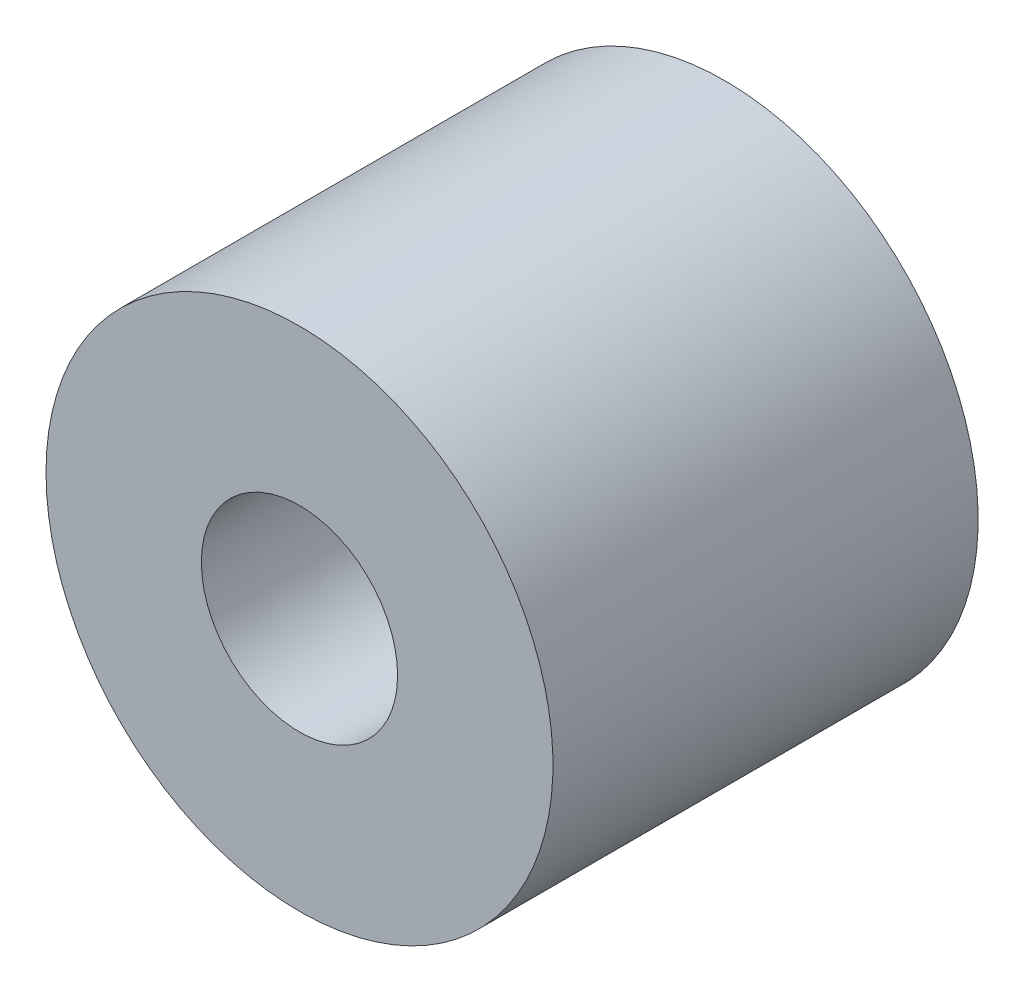
ISO-10303-21;
HEADER;
FILE_DESCRIPTION(('STEP AP214'),'2;1');
FILE_NAME('part.step','',(''),(''),'','','');
FILE_SCHEMA(('AUTOMOTIVE_DESIGN { 1 0 10303 214 1 1 1 1 }'));
ENDSEC;
DATA;
#1=APPLICATION_CONTEXT('core data for automotive mechanical design processes');
#2=APPLICATION_PROTOCOL_DEFINITION('international standard','automotive_design',2000,#1);
#3=PRODUCT_CONTEXT('',#1,'mechanical');
#4=PRODUCT('Part','Part','',(#3));
#5=PRODUCT_RELATED_PRODUCT_CATEGORY('part','',(#4));
#6=PRODUCT_DEFINITION_FORMATION('','',#4);
#7=PRODUCT_DEFINITION_CONTEXT('part definition',#1,'design');
#8=PRODUCT_DEFINITION('design','',#6,#7);
#9=PRODUCT_DEFINITION_SHAPE('','',#8);
#10=(LENGTH_UNIT() NAMED_UNIT(*) SI_UNIT(.MILLI.,.METRE.));
#11=(NAMED_UNIT(*) PLANE_ANGLE_UNIT() SI_UNIT($,.RADIAN.));
#12=(NAMED_UNIT(*) SI_UNIT($,.STERADIAN.) SOLID_ANGLE_UNIT());
#13=UNCERTAINTY_MEASURE_WITH_UNIT(LENGTH_MEASURE(1.E-05),#10,'distance_accuracy_value','');
#14=(GEOMETRIC_REPRESENTATION_CONTEXT(3) GLOBAL_UNCERTAINTY_ASSIGNED_CONTEXT((#13)) GLOBAL_UNIT_ASSIGNED_CONTEXT((#10,
#11,#12)) REPRESENTATION_CONTEXT('',''));
#15=CARTESIAN_POINT('',(0.,0.,0.));
#16=DIRECTION('',(0.,0.,1.));
#17=DIRECTION('',(1.,0.,0.));
#18=AXIS2_PLACEMENT_3D('',#15,#16,#17);
#19=CARTESIAN_POINT('',(0.,0.,-13.));
#20=DIRECTION('',(0.,0.,-1.));
#21=DIRECTION('',(1.,0.,0.));
#22=AXIS2_PLACEMENT_3D('',#19,#20,#21);
#23=PLANE('',#22);
#24=CARTESIAN_POINT('',(0.,0.,-13.));
#25=DIRECTION('',(0.,0.,1.));
#26=DIRECTION('',(1.,0.,0.));
#27=AXIS2_PLACEMENT_3D('',#24,#25,#26);
#28=CIRCLE('',#27,7.75);
#29=CARTESIAN_POINT('',(-7.75,0.,-13.));
#30=VERTEX_POINT('',#29);
#31=EDGE_CURVE('E10',#30,#30,#28,.T.);
#32=ORIENTED_EDGE('',*,*,#31,.F.);
#33=EDGE_LOOP('',(#32));
#34=FACE_BOUND('',#33,.T.);
#35=CARTESIAN_POINT('',(0.,0.,-13.));
#36=DIRECTION('',(0.,0.,1.));
#37=DIRECTION('',(1.,0.,0.));
#38=AXIS2_PLACEMENT_3D('',#35,#36,#37);
#39=CIRCLE('',#38,3.);
#40=CARTESIAN_POINT('',(-3.,0.,-13.));
#41=VERTEX_POINT('',#40);
#42=EDGE_CURVE('E46',#41,#41,#39,.T.);
#43=ORIENTED_EDGE('',*,*,#42,.T.);
#44=EDGE_LOOP('',(#43));
#45=FACE_BOUND('',#44,.T.);
#46=ADVANCED_FACE('F35',(#34,#45),#23,.T.);
#47=CARTESIAN_POINT('',(0.,0.,0.));
#48=DIRECTION('',(0.,0.,-1.));
#49=DIRECTION('',(1.,0.,0.));
#50=AXIS2_PLACEMENT_3D('',#47,#48,#49);
#51=PLANE('',#50);
#52=CARTESIAN_POINT('',(0.,0.,0.));
#53=DIRECTION('',(0.,0.,1.));
#54=DIRECTION('',(1.,0.,0.));
#55=AXIS2_PLACEMENT_3D('',#52,#53,#54);
#56=CIRCLE('',#55,7.75);
#57=CARTESIAN_POINT('',(-7.75,0.,0.));
#58=VERTEX_POINT('',#57);
#59=EDGE_CURVE('E39',#58,#58,#56,.T.);
#60=ORIENTED_EDGE('',*,*,#59,.T.);
#61=EDGE_LOOP('',(#60));
#62=FACE_BOUND('',#61,.T.);
#63=CARTESIAN_POINT('',(0.,0.,0.));
#64=DIRECTION('',(0.,0.,1.));
#65=DIRECTION('',(1.,0.,0.));
#66=AXIS2_PLACEMENT_3D('',#63,#64,#65);
#67=CIRCLE('',#66,3.);
#68=CARTESIAN_POINT('',(-3.,0.,0.));
#69=VERTEX_POINT('',#68);
#70=EDGE_CURVE('E48',#69,#69,#67,.T.);
#71=ORIENTED_EDGE('',*,*,#70,.F.);
#72=EDGE_LOOP('',(#71));
#73=FACE_BOUND('',#72,.T.);
#74=ADVANCED_FACE('F61',(#62,#73),#51,.F.);
#75=CARTESIAN_POINT('',(0.,0.,-13.));
#76=DIRECTION('',(0.,0.,1.));
#77=DIRECTION('',(-1.,0.,0.));
#78=AXIS2_PLACEMENT_3D('',#75,#76,#77);
#79=CYLINDRICAL_SURFACE('',#78,7.75);
#80=CARTESIAN_POINT('',(-7.75,0.,-13.));
#81=CARTESIAN_POINT('',(-7.75,0.,-12.8645833333333));
#82=CARTESIAN_POINT('',(-7.75,0.,-12.7291666666667));
#83=CARTESIAN_POINT('',(-7.75,0.,-12.4583333333333));
#84=CARTESIAN_POINT('',(-7.75,0.,-12.3229166666667));
#85=CARTESIAN_POINT('',(-7.75,0.,-12.0520833333333));
#86=CARTESIAN_POINT('',(-7.75,0.,-11.9166666666667));
#87=CARTESIAN_POINT('',(-7.75,0.,-11.6458333333333));
#88=CARTESIAN_POINT('',(-7.75,0.,-11.5104166666667));
#89=CARTESIAN_POINT('',(-7.75,0.,-11.2395833333333));
#90=CARTESIAN_POINT('',(-7.75,0.,-11.1041666666667));
#91=CARTESIAN_POINT('',(-7.75,0.,-10.8333333333333));
#92=CARTESIAN_POINT('',(-7.75,0.,-10.6979166666667));
#93=CARTESIAN_POINT('',(-7.75,0.,-10.4270833333333));
#94=CARTESIAN_POINT('',(-7.75,0.,-10.2916666666667));
#95=CARTESIAN_POINT('',(-7.75,0.,-10.0208333333333));
#96=CARTESIAN_POINT('',(-7.75,0.,-9.88541666666667));
#97=CARTESIAN_POINT('',(-7.75,0.,-9.61458333333333));
#98=CARTESIAN_POINT('',(-7.75,0.,-9.47916666666667));
#99=CARTESIAN_POINT('',(-7.75,0.,-9.20833333333333));
#100=CARTESIAN_POINT('',(-7.75,0.,-9.07291666666667));
#101=CARTESIAN_POINT('',(-7.75,0.,-8.80208333333333));
#102=CARTESIAN_POINT('',(-7.75,0.,-8.66666666666667));
#103=CARTESIAN_POINT('',(-7.75,0.,-8.39583333333333));
#104=CARTESIAN_POINT('',(-7.75,0.,-8.26041666666667));
#105=CARTESIAN_POINT('',(-7.75,0.,-7.98958333333333));
#106=CARTESIAN_POINT('',(-7.75,0.,-7.85416666666667));
#107=CARTESIAN_POINT('',(-7.75,0.,-7.58333333333333));
#108=CARTESIAN_POINT('',(-7.75,0.,-7.44791666666667));
#109=CARTESIAN_POINT('',(-7.75,0.,-7.17708333333333));
#110=CARTESIAN_POINT('',(-7.75,0.,-7.04166666666667));
#111=CARTESIAN_POINT('',(-7.75,0.,-6.77083333333333));
#112=CARTESIAN_POINT('',(-7.75,0.,-6.63541666666667));
#113=CARTESIAN_POINT('',(-7.75,0.,-6.36458333333333));
#114=CARTESIAN_POINT('',(-7.75,0.,-6.22916666666667));
#115=CARTESIAN_POINT('',(-7.75,0.,-5.95833333333333));
#116=CARTESIAN_POINT('',(-7.75,0.,-5.82291666666667));
#117=CARTESIAN_POINT('',(-7.75,0.,-5.55208333333333));
#118=CARTESIAN_POINT('',(-7.75,0.,-5.41666666666667));
#119=CARTESIAN_POINT('',(-7.75,0.,-5.14583333333333));
#120=CARTESIAN_POINT('',(-7.75,0.,-5.01041666666667));
#121=CARTESIAN_POINT('',(-7.75,0.,-4.73958333333333));
#122=CARTESIAN_POINT('',(-7.75,0.,-4.60416666666667));
#123=CARTESIAN_POINT('',(-7.75,0.,-4.33333333333333));
#124=CARTESIAN_POINT('',(-7.75,0.,-4.19791666666667));
#125=CARTESIAN_POINT('',(-7.75,0.,-3.92708333333333));
#126=CARTESIAN_POINT('',(-7.75,0.,-3.79166666666667));
#127=CARTESIAN_POINT('',(-7.75,0.,-3.52083333333333));
#128=CARTESIAN_POINT('',(-7.75,0.,-3.38541666666667));
#129=CARTESIAN_POINT('',(-7.75,0.,-3.11458333333333));
#130=CARTESIAN_POINT('',(-7.75,0.,-2.97916666666667));
#131=CARTESIAN_POINT('',(-7.75,0.,-2.70833333333333));
#132=CARTESIAN_POINT('',(-7.75,0.,-2.57291666666667));
#133=CARTESIAN_POINT('',(-7.75,0.,-2.30208333333333));
#134=CARTESIAN_POINT('',(-7.75,0.,-2.16666666666667));
#135=CARTESIAN_POINT('',(-7.75,0.,-1.89583333333333));
#136=CARTESIAN_POINT('',(-7.75,0.,-1.76041666666667));
#137=CARTESIAN_POINT('',(-7.75,0.,-1.48958333333333));
#138=CARTESIAN_POINT('',(-7.75,0.,-1.35416666666667));
#139=CARTESIAN_POINT('',(-7.75,0.,-1.08333333333333));
#140=CARTESIAN_POINT('',(-7.75,0.,-0.947916666666667));
#141=CARTESIAN_POINT('',(-7.75,0.,-0.677083333333334));
#142=CARTESIAN_POINT('',(-7.75,0.,-0.541666666666667));
#143=CARTESIAN_POINT('',(-7.75,0.,-0.270833333333334));
#144=CARTESIAN_POINT('',(-7.75,0.,-0.135416666666667));
#145=CARTESIAN_POINT('',(-7.75,0.,0.));
#146=B_SPLINE_CURVE_WITH_KNOTS('',3,(#80,#81,#82,#83,#84,#85,#86,#87,#88,#89,#90,#91,#92,#93,
#94,#95,#96,#97,#98,#99,#100,#101,#102,#103,#104,#105,#106,#107,#108,#109,#110,#111,#112,#113,
#114,#115,#116,#117,#118,#119,#120,#121,#122,#123,#124,#125,#126,#127,#128,#129,#130,#131,#132,
#133,#134,#135,#136,#137,#138,#139,#140,#141,#142,#143,#144,#145),.UNSPECIFIED.,.F.,.F.,(4,2,2,
2,2,2,2,2,2,2,2,2,2,2,2,2,2,2,2,2,2,2,2,2,2,2,2,2,2,2,2,2,4),(0.,0.406249999999999,
0.812499999999999,1.21875,1.625,2.03125,2.4375,2.84375,3.25,3.65625,4.0625,4.46875,4.875,
5.28125,5.6875,6.09375,6.5,6.90625,7.3125,7.71875,8.125,8.53125,8.9375,9.34375,9.75,10.15625,
10.5625,10.96875,11.375,11.78125,12.1875,12.59375,13.),.UNSPECIFIED.);
#147=EDGE_CURVE('BSEAM37',#30,#58,#146,.T.);
#148=ORIENTED_EDGE('',*,*,#31,.T.);
#149=ORIENTED_EDGE('',*,*,#59,.F.);
#150=ORIENTED_EDGE('',*,*,#147,.T.);
#151=ORIENTED_EDGE('',*,*,#147,.F.);
#152=EDGE_LOOP('',(#148,#150,#149,#151));
#153=FACE_BOUND('',#152,.T.);
#154=ADVANCED_FACE('F37',(#153),#79,.T.);
#155=CARTESIAN_POINT('',(0.,0.,-13.));
#156=DIRECTION('',(0.,0.,1.));
#157=DIRECTION('',(-1.,0.,0.));
#158=AXIS2_PLACEMENT_3D('',#155,#156,#157);
#159=CYLINDRICAL_SURFACE('',#158,3.);
#160=CARTESIAN_POINT('',(-3.,0.,-13.));
#161=CARTESIAN_POINT('',(-3.,0.,-12.8645833333333));
#162=CARTESIAN_POINT('',(-3.,0.,-12.7291666666667));
#163=CARTESIAN_POINT('',(-3.,0.,-12.4583333333333));
#164=CARTESIAN_POINT('',(-3.,0.,-12.3229166666667));
#165=CARTESIAN_POINT('',(-3.,0.,-12.0520833333333));
#166=CARTESIAN_POINT('',(-3.,0.,-11.9166666666667));
#167=CARTESIAN_POINT('',(-3.,0.,-11.6458333333333));
#168=CARTESIAN_POINT('',(-3.,0.,-11.5104166666667));
#169=CARTESIAN_POINT('',(-3.,0.,-11.2395833333333));
#170=CARTESIAN_POINT('',(-3.,0.,-11.1041666666667));
#171=CARTESIAN_POINT('',(-3.,0.,-10.8333333333333));
#172=CARTESIAN_POINT('',(-3.,0.,-10.6979166666667));
#173=CARTESIAN_POINT('',(-3.,0.,-10.4270833333333));
#174=CARTESIAN_POINT('',(-3.,0.,-10.2916666666667));
#175=CARTESIAN_POINT('',(-3.,0.,-10.0208333333333));
#176=CARTESIAN_POINT('',(-3.,0.,-9.88541666666667));
#177=CARTESIAN_POINT('',(-3.,0.,-9.61458333333333));
#178=CARTESIAN_POINT('',(-3.,0.,-9.47916666666667));
#179=CARTESIAN_POINT('',(-3.,0.,-9.20833333333333));
#180=CARTESIAN_POINT('',(-3.,0.,-9.07291666666667));
#181=CARTESIAN_POINT('',(-3.,0.,-8.80208333333333));
#182=CARTESIAN_POINT('',(-3.,0.,-8.66666666666667));
#183=CARTESIAN_POINT('',(-3.,0.,-8.39583333333333));
#184=CARTESIAN_POINT('',(-3.,0.,-8.26041666666667));
#185=CARTESIAN_POINT('',(-3.,0.,-7.98958333333333));
#186=CARTESIAN_POINT('',(-3.,0.,-7.85416666666667));
#187=CARTESIAN_POINT('',(-3.,0.,-7.58333333333333));
#188=CARTESIAN_POINT('',(-3.,0.,-7.44791666666667));
#189=CARTESIAN_POINT('',(-3.,0.,-7.17708333333333));
#190=CARTESIAN_POINT('',(-3.,0.,-7.04166666666667));
#191=CARTESIAN_POINT('',(-3.,0.,-6.77083333333333));
#192=CARTESIAN_POINT('',(-3.,0.,-6.63541666666667));
#193=CARTESIAN_POINT('',(-3.,0.,-6.36458333333333));
#194=CARTESIAN_POINT('',(-3.,0.,-6.22916666666667));
#195=CARTESIAN_POINT('',(-3.,0.,-5.95833333333333));
#196=CARTESIAN_POINT('',(-3.,0.,-5.82291666666667));
#197=CARTESIAN_POINT('',(-3.,0.,-5.55208333333333));
#198=CARTESIAN_POINT('',(-3.,0.,-5.41666666666667));
#199=CARTESIAN_POINT('',(-3.,0.,-5.14583333333333));
#200=CARTESIAN_POINT('',(-3.,0.,-5.01041666666667));
#201=CARTESIAN_POINT('',(-3.,0.,-4.73958333333333));
#202=CARTESIAN_POINT('',(-3.,0.,-4.60416666666667));
#203=CARTESIAN_POINT('',(-3.,0.,-4.33333333333333));
#204=CARTESIAN_POINT('',(-3.,0.,-4.19791666666667));
#205=CARTESIAN_POINT('',(-3.,0.,-3.92708333333333));
#206=CARTESIAN_POINT('',(-3.,0.,-3.79166666666667));
#207=CARTESIAN_POINT('',(-3.,0.,-3.52083333333333));
#208=CARTESIAN_POINT('',(-3.,0.,-3.38541666666667));
#209=CARTESIAN_POINT('',(-3.,0.,-3.11458333333333));
#210=CARTESIAN_POINT('',(-3.,0.,-2.97916666666667));
#211=CARTESIAN_POINT('',(-3.,0.,-2.70833333333333));
#212=CARTESIAN_POINT('',(-3.,0.,-2.57291666666667));
#213=CARTESIAN_POINT('',(-3.,0.,-2.30208333333333));
#214=CARTESIAN_POINT('',(-3.,0.,-2.16666666666667));
#215=CARTESIAN_POINT('',(-3.,0.,-1.89583333333333));
#216=CARTESIAN_POINT('',(-3.,0.,-1.76041666666667));
#217=CARTESIAN_POINT('',(-3.,0.,-1.48958333333333));
#218=CARTESIAN_POINT('',(-3.,0.,-1.35416666666667));
#219=CARTESIAN_POINT('',(-3.,0.,-1.08333333333333));
#220=CARTESIAN_POINT('',(-3.,0.,-0.947916666666667));
#221=CARTESIAN_POINT('',(-3.,0.,-0.677083333333334));
#222=CARTESIAN_POINT('',(-3.,0.,-0.541666666666667));
#223=CARTESIAN_POINT('',(-3.,0.,-0.270833333333334));
#224=CARTESIAN_POINT('',(-3.,0.,-0.135416666666667));
#225=CARTESIAN_POINT('',(-3.,0.,0.));
#226=B_SPLINE_CURVE_WITH_KNOTS('',3,(#160,#161,#162,#163,#164,#165,#166,#167,#168,#169,#170,
#171,#172,#173,#174,#175,#176,#177,#178,#179,#180,#181,#182,#183,#184,#185,#186,#187,#188,#189,
#190,#191,#192,#193,#194,#195,#196,#197,#198,#199,#200,#201,#202,#203,#204,#205,#206,#207,#208,
#209,#210,#211,#212,#213,#214,#215,#216,#217,#218,#219,#220,#221,#222,#223,#224,#225),
.UNSPECIFIED.,.F.,.F.,(4,2,2,2,2,2,2,2,2,2,2,2,2,2,2,2,2,2,2,2,2,2,2,2,2,2,2,2,2,2,2,2,4),(0.,
0.406249999999999,0.812499999999999,1.21875,1.625,2.03125,2.4375,2.84375,3.25,3.65625,4.0625,
4.46875,4.875,5.28125,5.6875,6.09375,6.5,6.90625,7.3125,7.71875,8.125,8.53125,8.9375,9.34375,
9.75,10.15625,10.5625,10.96875,11.375,11.78125,12.1875,12.59375,13.),.UNSPECIFIED.);
#227=EDGE_CURVE('BSEAM55',#41,#69,#226,.T.);
#228=ORIENTED_EDGE('',*,*,#42,.F.);
#229=ORIENTED_EDGE('',*,*,#70,.T.);
#230=ORIENTED_EDGE('',*,*,#227,.T.);
#231=ORIENTED_EDGE('',*,*,#227,.F.);
#232=EDGE_LOOP('',(#228,#230,#229,#231));
#233=FACE_BOUND('',#232,.T.);
#234=ADVANCED_FACE('F55',(#233),#159,.F.);
#235=CLOSED_SHELL('',(#46,#74,#154,#234));
#236=MANIFOLD_SOLID_BREP('B2',#235);
#237=ADVANCED_BREP_SHAPE_REPRESENTATION('',(#18,#236),#14);
#238=SHAPE_DEFINITION_REPRESENTATION(#9,#237);
ENDSEC;
END-ISO-10303-21;
